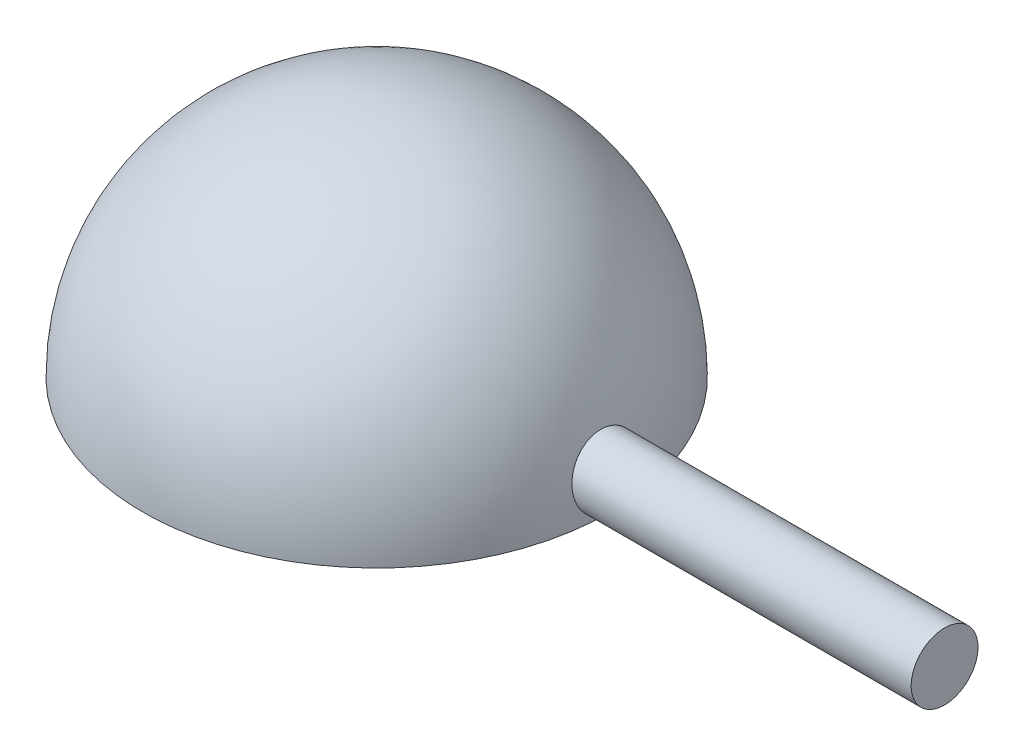
ISO-10303-21;
HEADER;
FILE_DESCRIPTION(('STEP AP214'),'2;1');
FILE_NAME('part.step','',(''),(''),'','','');
FILE_SCHEMA(('AUTOMOTIVE_DESIGN { 1 0 10303 214 1 1 1 1 }'));
ENDSEC;
DATA;
#1=APPLICATION_CONTEXT('core data for automotive mechanical design processes');
#2=APPLICATION_PROTOCOL_DEFINITION('international standard','automotive_design',2000,#1);
#3=PRODUCT_CONTEXT('',#1,'mechanical');
#4=PRODUCT('Part','Part','',(#3));
#5=PRODUCT_RELATED_PRODUCT_CATEGORY('part','',(#4));
#6=PRODUCT_DEFINITION_FORMATION('','',#4);
#7=PRODUCT_DEFINITION_CONTEXT('part definition',#1,'design');
#8=PRODUCT_DEFINITION('design','',#6,#7);
#9=PRODUCT_DEFINITION_SHAPE('','',#8);
#10=(LENGTH_UNIT() NAMED_UNIT(*) SI_UNIT(.MILLI.,.METRE.));
#11=(NAMED_UNIT(*) PLANE_ANGLE_UNIT() SI_UNIT($,.RADIAN.));
#12=(NAMED_UNIT(*) SI_UNIT($,.STERADIAN.) SOLID_ANGLE_UNIT());
#13=UNCERTAINTY_MEASURE_WITH_UNIT(LENGTH_MEASURE(1.E-05),#10,'distance_accuracy_value','');
#14=(GEOMETRIC_REPRESENTATION_CONTEXT(3) GLOBAL_UNCERTAINTY_ASSIGNED_CONTEXT((#13)) GLOBAL_UNIT_ASSIGNED_CONTEXT((#10,
#11,#12)) REPRESENTATION_CONTEXT('',''));
#15=CARTESIAN_POINT('',(0.,0.,0.));
#16=DIRECTION('',(0.,0.,1.));
#17=DIRECTION('',(1.,0.,0.));
#18=AXIS2_PLACEMENT_3D('',#15,#16,#17);
#19=CARTESIAN_POINT('',(0.,0.,0.));
#20=DIRECTION('',(0.,-1.,0.));
#21=DIRECTION('',(-1.,0.,0.));
#22=AXIS2_PLACEMENT_3D('',#19,#20,#21);
#23=SPHERICAL_SURFACE('',#22,33.);
#24=CARTESIAN_POINT('',(0.,0.,0.));
#25=DIRECTION('',(0.,-1.,0.));
#26=DIRECTION('',(0.,0.,-1.));
#27=AXIS2_PLACEMENT_3D('',#24,#25,#26);
#28=CIRCLE('',#27,33.);
#29=CARTESIAN_POINT('',(0.,0.,-33.));
#30=VERTEX_POINT('',#29);
#31=EDGE_CURVE('E45',#30,#30,#28,.T.);
#32=ORIENTED_EDGE('',*,*,#31,.T.);
#33=EDGE_LOOP('',(#32));
#34=FACE_BOUND('',#33,.T.);
#35=ADVANCED_FACE('F39',(#34),#23,.F.);
#36=CARTESIAN_POINT('',(0.,0.,0.));
#37=DIRECTION('',(0.,-1.,0.));
#38=DIRECTION('',(1.,0.,0.));
#39=AXIS2_PLACEMENT_3D('',#36,#37,#38);
#40=SPHERICAL_SURFACE('',#39,35.);
#41=CARTESIAN_POINT('',(0.,0.,0.));
#42=DIRECTION('',(0.,-1.,0.));
#43=DIRECTION('',(0.,0.,-1.));
#44=AXIS2_PLACEMENT_3D('',#41,#42,#43);
#45=CIRCLE('',#44,35.);
#46=CARTESIAN_POINT('',(35.,0.,0.));
#47=VERTEX_POINT('',#46);
#48=EDGE_CURVE('E11',#47,#47,#45,.T.);
#49=ORIENTED_EDGE('',*,*,#48,.F.);
#50=CARTESIAN_POINT('',(34.7695900565701,1.60756072980599,-3.67305809892051));
#51=CARTESIAN_POINT('',(34.7546343756495,1.71156131138589,-3.76911416464679));
#52=CARTESIAN_POINT('',(34.7390899813183,1.81958859274634,-3.86069839496242));
#53=CARTESIAN_POINT('',(34.7069259519891,2.04295495689035,-4.03433981390417));
#54=CARTESIAN_POINT('',(34.6903060070065,2.15829614742107,-4.11639423673049));
#55=CARTESIAN_POINT('',(34.6560958143781,2.39553157394247,-4.27045305734744));
#56=CARTESIAN_POINT('',(34.6385046205143,2.51743219727308,-4.34244740440803));
#57=CARTESIAN_POINT('',(34.6024835203177,2.76684586690589,-4.47582717889023));
#58=CARTESIAN_POINT('',(34.5840533054476,2.89436097727695,-4.53720866312224));
#59=CARTESIAN_POINT('',(34.5465120317997,3.15388583038368,-4.64884852893062));
#60=CARTESIAN_POINT('',(34.5274018291572,3.28588991262558,-4.69912036021388));
#61=CARTESIAN_POINT('',(34.4886050926432,3.55364951599286,-4.78831812335094));
#62=CARTESIAN_POINT('',(34.468918349263,3.68940639981558,-4.82723987296763));
#63=CARTESIAN_POINT('',(34.4291245526349,3.96357781481339,-4.89343484183484));
#64=CARTESIAN_POINT('',(34.4090177718139,4.10199061894563,-4.92071537946733));
#65=CARTESIAN_POINT('',(34.368503894757,4.38063505138479,-4.96349299280336));
#66=CARTESIAN_POINT('',(34.3480966900325,4.52086733445732,-4.97898569973762));
#67=CARTESIAN_POINT('',(34.307021658407,4.80286889421544,-4.99812149003642));
#68=CARTESIAN_POINT('',(34.2863530217184,4.94464237962899,-5.00170085775718));
#69=CARTESIAN_POINT('',(34.2450011177245,5.22803261120382,-4.99680819861627));
#70=CARTESIAN_POINT('',(34.2243178478357,5.36964927984415,-4.98833170678447));
#71=CARTESIAN_POINT('',(34.1830973003118,5.65162836567902,-4.95938119481663));
#72=CARTESIAN_POINT('',(34.1625599804156,5.79199114924906,-4.93891080392024));
#73=CARTESIAN_POINT('',(34.1217642006214,6.07056240782163,-4.88610289836148));
#74=CARTESIAN_POINT('',(34.1015058464384,6.20877006862548,-4.85376100674669));
#75=CARTESIAN_POINT('',(34.0613887440061,6.48221998402714,-4.77736419162972));
#76=CARTESIAN_POINT('',(34.0415307075019,6.61745698966444,-4.7332900983173));
#77=CARTESIAN_POINT('',(34.0023869485299,6.88380651141884,-4.63373471756814));
#78=CARTESIAN_POINT('',(33.9831014412353,7.01491747793526,-4.5782492019725));
#79=CARTESIAN_POINT('',(33.9452590066674,7.27197486986503,-4.45627092971237));
#80=CARTESIAN_POINT('',(33.9267018051871,7.39792323980495,-4.38978236584783));
#81=CARTESIAN_POINT('',(33.8904459753697,7.64380010585633,-4.24624830407986));
#82=CARTESIAN_POINT('',(33.8727476648165,7.7637263743925,-4.16919893847151));
#83=CARTESIAN_POINT('',(33.8213257358677,8.11190920986852,-3.92379730472096));
#84=CARTESIAN_POINT('',(33.7890501578056,8.33009722961962,-3.74046495253558));
#85=CARTESIAN_POINT('',(33.7294628833657,8.73242261249122,-3.33914050741052));
#86=CARTESIAN_POINT('',(33.7021509278142,8.91656175347069,-3.1211502252374));
#87=CARTESIAN_POINT('',(33.6535655921154,9.24381085251098,-2.65884349844207));
#88=CARTESIAN_POINT('',(33.632236275563,9.38730100566345,-2.41480255121438));
#89=CARTESIAN_POINT('',(33.5959540576205,9.63122022769572,-1.90564589343135));
#90=CARTESIAN_POINT('',(33.5810007749697,9.73165187130065,-1.64053144411045));
#91=CARTESIAN_POINT('',(33.5580725572534,9.88558973287011,-1.09966421883852));
#92=CARTESIAN_POINT('',(33.5500278164757,9.93956536724305,-0.824047974926512));
#93=CARTESIAN_POINT('',(33.5409192818468,10.0006755125237,-0.267561503215945));
#94=CARTESIAN_POINT('',(33.5398551898514,10.0078120239358,0.0133084996801132));
#95=CARTESIAN_POINT('',(33.5447270071788,9.97512954882625,0.570541064813531));
#96=CARTESIAN_POINT('',(33.5506209505525,9.93559206687651,0.846920561065978));
#97=CARTESIAN_POINT('',(33.5691501740116,9.81122414910788,1.38905208005137));
#98=CARTESIAN_POINT('',(33.5817854218031,9.72639393026209,1.65480415368802));
#99=CARTESIAN_POINT('',(33.6134128197988,9.51387273318164,2.16847612253743));
#100=CARTESIAN_POINT('',(33.6324113251901,9.38613890539057,2.41637788814785));
#101=CARTESIAN_POINT('',(33.6761704378243,9.09160215302215,2.88719699555264));
#102=CARTESIAN_POINT('',(33.7009312313224,8.92479796556664,3.1101135294005));
#103=CARTESIAN_POINT('',(33.7556670202333,8.55556965136754,3.5264597260555));
#104=CARTESIAN_POINT('',(33.7856795821239,8.35288876473953,3.71965669610683));
#105=CARTESIAN_POINT('',(33.8498905173691,7.91859410623145,4.06934212276648));
#106=CARTESIAN_POINT('',(33.8840891174996,7.68697876683296,4.22582858926754));
#107=CARTESIAN_POINT('',(33.9560519626332,7.19878414971013,4.49938367949904));
#108=CARTESIAN_POINT('',(33.9938498347065,6.94196858132178,4.61602179006494));
#109=CARTESIAN_POINT('',(34.0716084092249,6.41270112569783,4.80449789612648));
#110=CARTESIAN_POINT('',(34.111569224896,6.14024841984243,4.87633354382796));
#111=CARTESIAN_POINT('',(34.1928803546391,5.58485996767047,4.97374295756419));
#112=CARTESIAN_POINT('',(34.2342398152664,5.30185295711859,4.99890311752152));
#113=CARTESIAN_POINT('',(34.3168377904363,4.73563500272117,5.00102661488383));
#114=CARTESIAN_POINT('',(34.3580763014747,4.4524240532577,4.97798856949643));
#115=CARTESIAN_POINT('',(34.4394116384002,3.89285860602704,4.88415680707709));
#116=CARTESIAN_POINT('',(34.4795041947329,3.6165301452678,4.81320396787727));
#117=CARTESIAN_POINT('',(34.5572755904743,3.07962170466388,4.62525922279874));
#118=CARTESIAN_POINT('',(34.5949544540663,2.81904156703529,4.50826777827335));
#119=CARTESIAN_POINT('',(34.6667045497534,2.32208803492612,4.23194841301962));
#120=CARTESIAN_POINT('',(34.7007878641883,2.08563366321822,4.07276903481624));
#121=CARTESIAN_POINT('',(34.764547378991,1.64272632093546,3.71610325342091));
#122=CARTESIAN_POINT('',(34.7942237588764,1.43627212830384,3.5186184113669));
#123=CARTESIAN_POINT('',(34.8346454933225,1.15476538614682,3.19909397434192));
#124=CARTESIAN_POINT('',(34.8473963588832,1.06591127046811,3.08916557997414));
#125=CARTESIAN_POINT('',(34.8715137638539,0.89776729456006,2.86209796836144));
#126=CARTESIAN_POINT('',(34.8828808348951,0.818473761423757,2.74496154652692));
#127=CARTESIAN_POINT('',(34.9041525567677,0.670024764274074,2.50426150671944));
#128=CARTESIAN_POINT('',(34.9140567117646,0.600872737635114,2.3806957287097));
#129=CARTESIAN_POINT('',(34.9323244583994,0.473279134118032,2.12809958682826));
#130=CARTESIAN_POINT('',(34.9406886396487,0.41483345813117,1.99907133774857));
#131=CARTESIAN_POINT('',(34.9557476359737,0.309576340480764,1.73769574274001));
#132=CARTESIAN_POINT('',(34.9624576215252,0.262659185930376,1.60539182688627));
#133=CARTESIAN_POINT('',(34.9742606412185,0.180112746079556,1.33729260399713));
#134=CARTESIAN_POINT('',(34.979354293288,0.144479147062837,1.20149865272422));
#135=CARTESIAN_POINT('',(34.98789271625,0.0847381585053929,0.927305128751517));
#136=CARTESIAN_POINT('',(34.9913369964699,0.060634198927062,0.788904793387456));
#137=CARTESIAN_POINT('',(34.9965485900491,0.024159357629311,0.510587871782636));
#138=CARTESIAN_POINT('',(34.9983165337706,0.0117840655140711,0.37067187551832));
#139=CARTESIAN_POINT('',(35.000158710121,-0.00111088899805663,0.091226922933797));
#140=CARTESIAN_POINT('',(35.0002442477029,-0.00170968374249919,-0.048298313182331));
#141=CARTESIAN_POINT('',(34.9987501316314,0.00874897796501367,-0.326850104886782));
#142=CARTESIAN_POINT('',(34.9971711011458,0.0198020722744057,-0.465876827559713));
#143=CARTESIAN_POINT('',(34.992358602725,0.0534845203528655,-0.742577116545124));
#144=CARTESIAN_POINT('',(34.9891241345457,0.076120872925216,-0.880249813414427));
#145=CARTESIAN_POINT('',(34.9810247436462,0.132792425387604,-1.15312698456434));
#146=CARTESIAN_POINT('',(34.9761604172525,0.166823456230869,-1.28833234253549));
#147=CARTESIAN_POINT('',(34.9648372616512,0.24601872774912,-1.55532815278078));
#148=CARTESIAN_POINT('',(34.9583789220813,0.291179549647469,-1.68711963999312));
#149=CARTESIAN_POINT('',(34.9439152783369,0.392283726382223,-1.94635575870995));
#150=CARTESIAN_POINT('',(34.9359105336519,0.448223181490369,-2.07380194278426));
#151=CARTESIAN_POINT('',(34.9184163853222,0.570427353371755,-2.32339737077759));
#152=CARTESIAN_POINT('',(34.9089283156145,0.636682792884223,-2.44555124916119));
#153=CARTESIAN_POINT('',(34.8885321139575,0.779043086319541,-2.68379937427167));
#154=CARTESIAN_POINT('',(34.8776243576787,0.855145334596984,-2.79989521270215));
#155=CARTESIAN_POINT('',(34.8518776884802,1.0346822177886,-3.0504085169511));
#156=CARTESIAN_POINT('',(34.8367044159362,1.1404285020483,-3.183143524435));
#157=CARTESIAN_POINT('',(34.804497747733,1.36471956355712,-3.43706753575842));
#158=CARTESIAN_POINT('',(34.7874643572977,1.4832643048638,-3.5582565720212));
#159=CARTESIAN_POINT('',(34.7695900565701,1.60756072980599,-3.67305809892051));
#160=B_SPLINE_CURVE_WITH_KNOTS('',3,(#50,#51,#52,#53,#54,#55,#56,#57,#58,#59,#60,#61,#62,#63,
#64,#65,#66,#67,#68,#69,#70,#71,#72,#73,#74,#75,#76,#77,#78,#79,#80,#81,#82,#83,#84,#85,#86,#87,
#88,#89,#90,#91,#92,#93,#94,#95,#96,#97,#98,#99,#100,#101,#102,#103,#104,#105,#106,#107,#108,
#109,#110,#111,#112,#113,#114,#115,#116,#117,#118,#119,#120,#121,#122,#123,#124,#125,#126,#127,
#128,#129,#130,#131,#132,#133,#134,#135,#136,#137,#138,#139,#140,#141,#142,#143,#144,#145,#146,
#147,#148,#149,#150,#151,#152,#153,#154,#155,#156,#157,#158,#159),.UNSPECIFIED.,.T.,.F.,(4,2,2,
2,2,2,2,2,2,2,2,2,2,2,2,2,2,2,2,2,2,2,2,2,2,2,2,2,2,2,2,2,2,2,2,2,2,2,2,2,2,2,2,2,2,2,2,2,2,2,2,
2,2,2,4),(0.,0.426930903466327,0.853985405458181,1.28146356050266,1.7091002045413,
2.13621626660712,2.56348951256594,2.99049375113152,3.417656167702,3.8470995203015,
4.27670196160891,4.70617447639301,5.13580549447399,5.56614286286901,5.99663996800776,
6.42697340491273,6.85746486696248,7.71339421928466,8.56927886670902,9.41687199660991,
10.2644144367907,11.1032887888299,11.9421273122139,12.7759322944094,13.6097332823305,
14.4443695092597,15.2790327180076,16.1199305273849,16.9608739120106,17.8106348580001,
18.6604403304747,19.5177408729047,20.3750660113733,21.2352523686148,22.0954301061398,
22.9526185162066,23.8097719989248,24.2351192317226,24.6603025338739,25.0856296167439,
25.5107935139792,25.931899669192,26.3528446401264,26.7739147605801,27.1948264808065,
27.6129089049821,28.0308348663149,28.4490136443736,28.867039587464,29.2849372837685,
29.7026840669,30.1200573135619,30.5373203406553,31.0475687759629,31.5578157783553),.UNSPECIFIED.);
#161=EDGE_CURVE('E49',#47,#47,#160,.T.);
#162=ORIENTED_EDGE('',*,*,#161,.F.);
#163=EDGE_LOOP('',(#49,#162));
#164=FACE_BOUND('',#163,.T.);
#165=ADVANCED_FACE('F70',(#164),#40,.T.);
#166=CARTESIAN_POINT('',(-35.,0.,0.));
#167=DIRECTION('',(0.,1.,0.));
#168=DIRECTION('',(0.,0.,1.));
#169=AXIS2_PLACEMENT_3D('',#166,#167,#168);
#170=PLANE('',#169);
#171=ORIENTED_EDGE('',*,*,#31,.F.);
#172=EDGE_LOOP('',(#171));
#173=FACE_BOUND('',#172,.T.);
#174=ORIENTED_EDGE('',*,*,#48,.T.);
#175=EDGE_LOOP('',(#174));
#176=FACE_BOUND('',#175,.T.);
#177=ADVANCED_FACE('F68',(#173,#176),#170,.F.);
#178=CARTESIAN_POINT('',(-35.002,5.,0.));
#179=DIRECTION('',(1.,0.,0.));
#180=DIRECTION('',(0.,0.,-1.));
#181=AXIS2_PLACEMENT_3D('',#178,#179,#180);
#182=CYLINDRICAL_SURFACE('',#181,5.);
#183=ORIENTED_EDGE('',*,*,#161,.T.);
#184=EDGE_LOOP('',(#183));
#185=FACE_BOUND('',#184,.T.);
#186=CARTESIAN_POINT('',(85.,5.,0.));
#187=DIRECTION('',(1.,0.,0.));
#188=DIRECTION('',(0.,0.,-1.));
#189=AXIS2_PLACEMENT_3D('',#186,#187,#188);
#190=CIRCLE('',#189,5.);
#191=CARTESIAN_POINT('',(85.,5.,-5.));
#192=VERTEX_POINT('',#191);
#193=EDGE_CURVE('E54',#192,#192,#190,.T.);
#194=ORIENTED_EDGE('',*,*,#193,.F.);
#195=EDGE_LOOP('',(#194));
#196=FACE_BOUND('',#195,.T.);
#197=ADVANCED_FACE('F50',(#185,#196),#182,.T.);
#198=CARTESIAN_POINT('',(85.,5.,0.));
#199=DIRECTION('',(1.,0.,0.));
#200=DIRECTION('',(0.,0.,-1.));
#201=AXIS2_PLACEMENT_3D('',#198,#199,#200);
#202=PLANE('',#201);
#203=ORIENTED_EDGE('',*,*,#193,.T.);
#204=EDGE_LOOP('',(#203));
#205=FACE_BOUND('',#204,.T.);
#206=ADVANCED_FACE('F100',(#205),#202,.T.);
#207=CLOSED_SHELL('',(#35,#165,#177,#197,#206));
#208=MANIFOLD_SOLID_BREP('B2',#207);
#209=ADVANCED_BREP_SHAPE_REPRESENTATION('',(#18,#208),#14);
#210=SHAPE_DEFINITION_REPRESENTATION(#9,#209);
ENDSEC;
END-ISO-10303-21;
